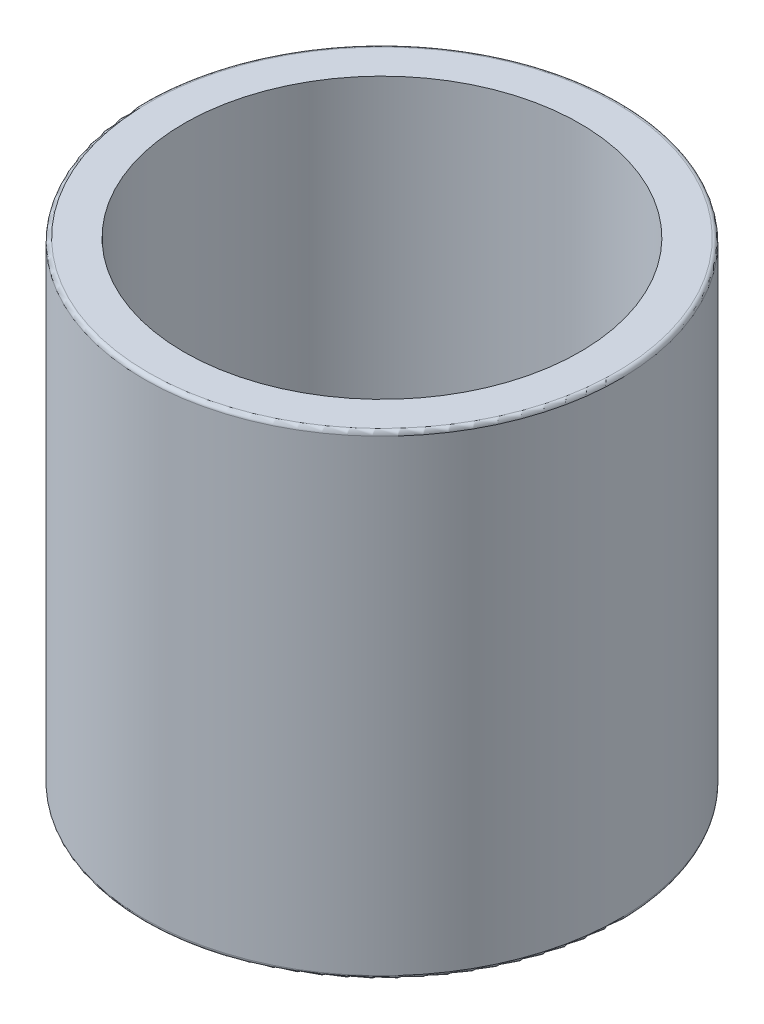
ISO-10303-21;
HEADER;
FILE_DESCRIPTION(('STEP AP214'),'2;1');
FILE_NAME('part.step','',(''),(''),'','','');
FILE_SCHEMA(('AUTOMOTIVE_DESIGN { 1 0 10303 214 1 1 1 1 }'));
ENDSEC;
DATA;
#1=APPLICATION_CONTEXT('core data for automotive mechanical design processes');
#2=APPLICATION_PROTOCOL_DEFINITION('international standard','automotive_design',2000,#1);
#3=PRODUCT_CONTEXT('',#1,'mechanical');
#4=PRODUCT('Part','Part','',(#3));
#5=PRODUCT_RELATED_PRODUCT_CATEGORY('part','',(#4));
#6=PRODUCT_DEFINITION_FORMATION('','',#4);
#7=PRODUCT_DEFINITION_CONTEXT('part definition',#1,'design');
#8=PRODUCT_DEFINITION('design','',#6,#7);
#9=PRODUCT_DEFINITION_SHAPE('','',#8);
#10=(LENGTH_UNIT() NAMED_UNIT(*) SI_UNIT(.MILLI.,.METRE.));
#11=(NAMED_UNIT(*) PLANE_ANGLE_UNIT() SI_UNIT($,.RADIAN.));
#12=(NAMED_UNIT(*) SI_UNIT($,.STERADIAN.) SOLID_ANGLE_UNIT());
#13=UNCERTAINTY_MEASURE_WITH_UNIT(LENGTH_MEASURE(1.E-05),#10,'distance_accuracy_value','');
#14=(GEOMETRIC_REPRESENTATION_CONTEXT(3) GLOBAL_UNCERTAINTY_ASSIGNED_CONTEXT((#13)) GLOBAL_UNIT_ASSIGNED_CONTEXT((#10,
#11,#12)) REPRESENTATION_CONTEXT('',''));
#15=CARTESIAN_POINT('',(0.,0.,0.));
#16=DIRECTION('',(0.,0.,1.));
#17=DIRECTION('',(1.,0.,0.));
#18=AXIS2_PLACEMENT_3D('',#15,#16,#17);
#19=CARTESIAN_POINT('',(0.,6.,0.));
#20=DIRECTION('',(0.,1.,0.));
#21=DIRECTION('',(0.,0.,1.));
#22=AXIS2_PLACEMENT_3D('',#19,#20,#21);
#23=PLANE('',#22);
#24=CARTESIAN_POINT('',(0.,6.,0.));
#25=DIRECTION('',(0.,1.,0.));
#26=DIRECTION('',(0.,0.,1.));
#27=AXIS2_PLACEMENT_3D('',#24,#25,#26);
#28=CIRCLE('',#27,5.9);
#29=CARTESIAN_POINT('',(0.,6.,5.9));
#30=VERTEX_POINT('',#29);
#31=EDGE_CURVE('E10',#30,#30,#28,.T.);
#32=ORIENTED_EDGE('',*,*,#31,.T.);
#33=EDGE_LOOP('',(#32));
#34=FACE_BOUND('',#33,.T.);
#35=CARTESIAN_POINT('',(0.,6.,0.));
#36=DIRECTION('',(0.,1.,0.));
#37=DIRECTION('',(0.,0.,1.));
#38=AXIS2_PLACEMENT_3D('',#35,#36,#37);
#39=CIRCLE('',#38,5.);
#40=CARTESIAN_POINT('',(0.,6.,5.));
#41=VERTEX_POINT('',#40);
#42=EDGE_CURVE('E53',#41,#41,#39,.T.);
#43=ORIENTED_EDGE('',*,*,#42,.F.);
#44=EDGE_LOOP('',(#43));
#45=FACE_BOUND('',#44,.T.);
#46=ADVANCED_FACE('F33',(#34,#45),#23,.T.);
#47=CARTESIAN_POINT('',(0.,-6.,0.));
#48=DIRECTION('',(0.,1.,0.));
#49=DIRECTION('',(0.,0.,1.));
#50=AXIS2_PLACEMENT_3D('',#47,#48,#49);
#51=PLANE('',#50);
#52=CARTESIAN_POINT('',(0.,-6.,0.));
#53=DIRECTION('',(0.,1.,0.));
#54=DIRECTION('',(0.,0.,1.));
#55=AXIS2_PLACEMENT_3D('',#52,#53,#54);
#56=CIRCLE('',#55,5.9);
#57=CARTESIAN_POINT('',(0.,-6.,5.9));
#58=VERTEX_POINT('',#57);
#59=EDGE_CURVE('E40',#58,#58,#56,.F.);
#60=ORIENTED_EDGE('',*,*,#59,.T.);
#61=EDGE_LOOP('',(#60));
#62=FACE_BOUND('',#61,.T.);
#63=CARTESIAN_POINT('',(0.,-6.,0.));
#64=DIRECTION('',(0.,1.,0.));
#65=DIRECTION('',(0.,0.,1.));
#66=AXIS2_PLACEMENT_3D('',#63,#64,#65);
#67=CIRCLE('',#66,5.);
#68=CARTESIAN_POINT('',(0.,-6.,5.));
#69=VERTEX_POINT('',#68);
#70=EDGE_CURVE('E54',#69,#69,#67,.T.);
#71=ORIENTED_EDGE('',*,*,#70,.T.);
#72=EDGE_LOOP('',(#71));
#73=FACE_BOUND('',#72,.T.);
#74=ADVANCED_FACE('F64',(#62,#73),#51,.F.);
#75=CARTESIAN_POINT('',(0.,6.,0.));
#76=DIRECTION('',(0.,-1.,0.));
#77=DIRECTION('',(0.,0.,-1.));
#78=AXIS2_PLACEMENT_3D('',#75,#76,#77);
#79=CYLINDRICAL_SURFACE('',#78,6.);
#80=CARTESIAN_POINT('',(0.,-5.9,0.));
#81=DIRECTION('',(0.,1.,0.));
#82=DIRECTION('',(0.,0.,1.));
#83=AXIS2_PLACEMENT_3D('',#80,#81,#82);
#84=CIRCLE('',#83,6.);
#85=CARTESIAN_POINT('',(0.,-5.9,6.));
#86=VERTEX_POINT('',#85);
#87=EDGE_CURVE('E44',#86,#86,#84,.T.);
#88=ORIENTED_EDGE('',*,*,#87,.T.);
#89=EDGE_LOOP('',(#88));
#90=FACE_BOUND('',#89,.T.);
#91=CARTESIAN_POINT('',(0.,5.9,0.));
#92=DIRECTION('',(0.,1.,0.));
#93=DIRECTION('',(0.,0.,1.));
#94=AXIS2_PLACEMENT_3D('',#91,#92,#93);
#95=CIRCLE('',#94,6.);
#96=CARTESIAN_POINT('',(0.,5.9,6.));
#97=VERTEX_POINT('',#96);
#98=EDGE_CURVE('E48',#97,#97,#95,.F.);
#99=ORIENTED_EDGE('',*,*,#98,.T.);
#100=EDGE_LOOP('',(#99));
#101=FACE_BOUND('',#100,.T.);
#102=ADVANCED_FACE('F69',(#90,#101),#79,.T.);
#103=CARTESIAN_POINT('',(0.,6.,0.));
#104=DIRECTION('',(0.,-1.,0.));
#105=DIRECTION('',(0.,0.,-1.));
#106=AXIS2_PLACEMENT_3D('',#103,#104,#105);
#107=CYLINDRICAL_SURFACE('',#106,5.);
#108=ORIENTED_EDGE('',*,*,#42,.T.);
#109=EDGE_LOOP('',(#108));
#110=FACE_BOUND('',#109,.T.);
#111=ORIENTED_EDGE('',*,*,#70,.F.);
#112=EDGE_LOOP('',(#111));
#113=FACE_BOUND('',#112,.T.);
#114=ADVANCED_FACE('F60',(#110,#113),#107,.F.);
#115=CARTESIAN_POINT('',(0.,-5.9,0.));
#116=DIRECTION('',(0.,1.,0.));
#117=DIRECTION('',(0.,0.,1.));
#118=AXIS2_PLACEMENT_3D('',#115,#116,#117);
#119=TOROIDAL_SURFACE('',#118,5.9,0.1);
#120=ORIENTED_EDGE('',*,*,#59,.F.);
#121=EDGE_LOOP('',(#120));
#122=FACE_BOUND('',#121,.T.);
#123=ORIENTED_EDGE('',*,*,#87,.F.);
#124=EDGE_LOOP('',(#123));
#125=FACE_BOUND('',#124,.T.);
#126=ADVANCED_FACE('F75',(#122,#125),#119,.T.);
#127=CARTESIAN_POINT('',(0.,5.9,0.));
#128=DIRECTION('',(0.,1.,0.));
#129=DIRECTION('',(0.,0.,1.));
#130=AXIS2_PLACEMENT_3D('',#127,#128,#129);
#131=TOROIDAL_SURFACE('',#130,5.9,0.1);
#132=ORIENTED_EDGE('',*,*,#98,.F.);
#133=EDGE_LOOP('',(#132));
#134=FACE_BOUND('',#133,.T.);
#135=ORIENTED_EDGE('',*,*,#31,.F.);
#136=EDGE_LOOP('',(#135));
#137=FACE_BOUND('',#136,.T.);
#138=ADVANCED_FACE('F35',(#134,#137),#131,.T.);
#139=CLOSED_SHELL('',(#46,#74,#102,#114,#126,#138));
#140=MANIFOLD_SOLID_BREP('B2',#139);
#141=ADVANCED_BREP_SHAPE_REPRESENTATION('',(#18,#140),#14);
#142=SHAPE_DEFINITION_REPRESENTATION(#9,#141);
ENDSEC;
END-ISO-10303-21;
